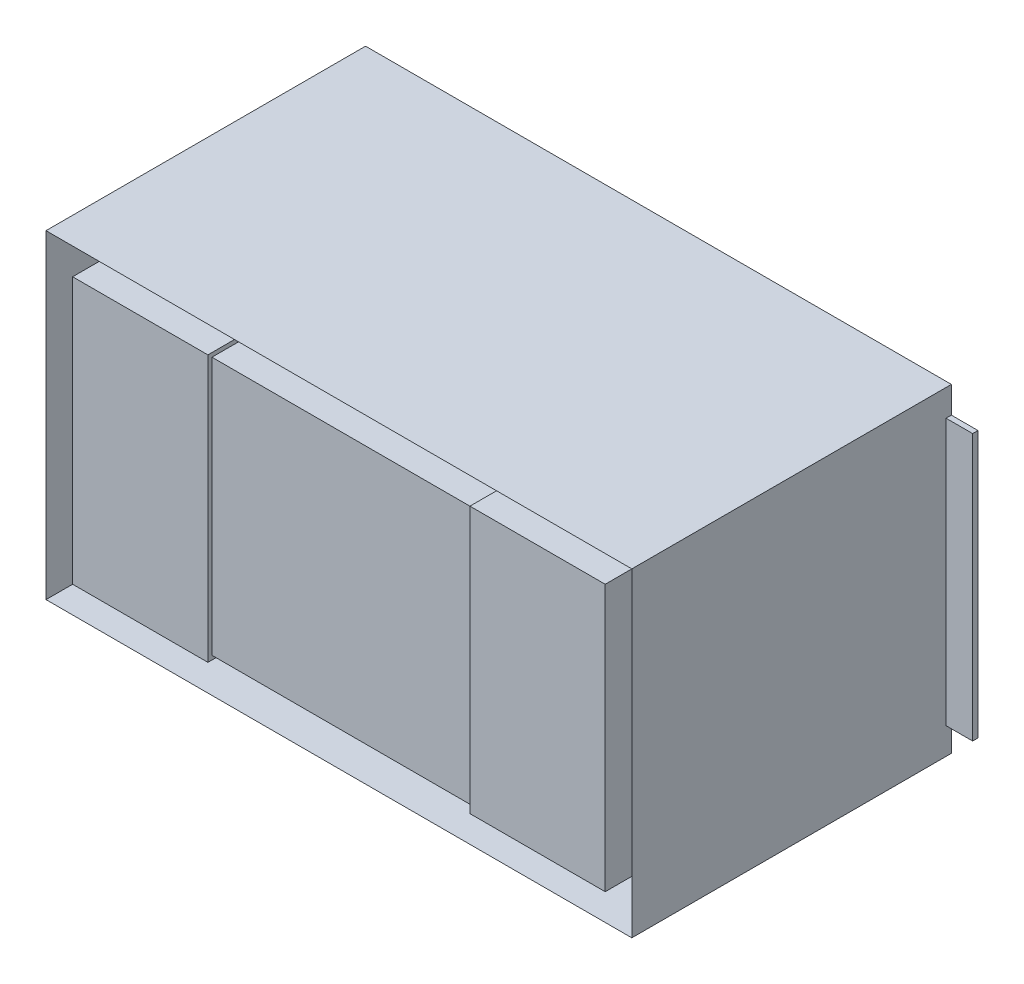
ISO-10303-21;
HEADER;
FILE_DESCRIPTION(('STEP AP214'),'2;1');
FILE_NAME('part.step','',(''),(''),'','','');
FILE_SCHEMA(('AUTOMOTIVE_DESIGN { 1 0 10303 214 1 1 1 1 }'));
ENDSEC;
DATA;
#1=APPLICATION_CONTEXT('core data for automotive mechanical design processes');
#2=APPLICATION_PROTOCOL_DEFINITION('international standard','automotive_design',2000,#1);
#3=PRODUCT_CONTEXT('',#1,'mechanical');
#4=PRODUCT('Part','Part','',(#3));
#5=PRODUCT_RELATED_PRODUCT_CATEGORY('part','',(#4));
#6=PRODUCT_DEFINITION_FORMATION('','',#4);
#7=PRODUCT_DEFINITION_CONTEXT('part definition',#1,'design');
#8=PRODUCT_DEFINITION('design','',#6,#7);
#9=PRODUCT_DEFINITION_SHAPE('','',#8);
#10=(LENGTH_UNIT() NAMED_UNIT(*) SI_UNIT(.MILLI.,.METRE.));
#11=(NAMED_UNIT(*) PLANE_ANGLE_UNIT() SI_UNIT($,.RADIAN.));
#12=(NAMED_UNIT(*) SI_UNIT($,.STERADIAN.) SOLID_ANGLE_UNIT());
#13=UNCERTAINTY_MEASURE_WITH_UNIT(LENGTH_MEASURE(1.E-05),#10,'distance_accuracy_value','');
#14=(GEOMETRIC_REPRESENTATION_CONTEXT(3) GLOBAL_UNCERTAINTY_ASSIGNED_CONTEXT((#13)) GLOBAL_UNIT_ASSIGNED_CONTEXT((#10,
#11,#12)) REPRESENTATION_CONTEXT('',''));
#15=CARTESIAN_POINT('',(0.,0.,0.));
#16=DIRECTION('',(0.,0.,1.));
#17=DIRECTION('',(1.,0.,0.));
#18=AXIS2_PLACEMENT_3D('',#15,#16,#17);
#19=CARTESIAN_POINT('',(-0.5999988,0.2500122,0.0762));
#20=DIRECTION('',(-1.,0.,0.));
#21=DIRECTION('',(0.,0.,1.));
#22=AXIS2_PLACEMENT_3D('',#19,#20,#21);
#23=PLANE('',#22);
#24=DIRECTION('',(0.,0.,1.));
#25=VECTOR('',#24,1.);
#26=CARTESIAN_POINT('',(-0.5999988,-0.2500081333333,0.0762));
#27=LINE('',#26,#25);
#28=CARTESIAN_POINT('',(-0.5999988,-0.2500081333333,0.0762));
#29=VERTEX_POINT('',#28);
#30=CARTESIAN_POINT('',(-0.5999988,-0.2500081333333,0.0862));
#31=VERTEX_POINT('',#30);
#32=EDGE_CURVE('P0_E325',#29,#31,#27,.T.);
#33=ORIENTED_EDGE('',*,*,#32,.T.);
#34=DIRECTION('',(0.,-1.,0.));
#35=VECTOR('',#34,1.);
#36=CARTESIAN_POINT('',(-0.5999988,0.2500081333333,0.0862));
#37=LINE('',#36,#35);
#38=CARTESIAN_POINT('',(-0.5999988,0.2500081333333,0.0862));
#39=VERTEX_POINT('',#38);
#40=EDGE_CURVE('P0_E345',#39,#31,#37,.T.);
#41=ORIENTED_EDGE('',*,*,#40,.F.);
#42=DIRECTION('',(0.,0.,1.));
#43=VECTOR('',#42,1.);
#44=CARTESIAN_POINT('',(-0.5999988,0.2500081333333,0.0762));
#45=LINE('',#44,#43);
#46=CARTESIAN_POINT('',(-0.5999988,0.2500081333333,0.0762));
#47=VERTEX_POINT('',#46);
#48=EDGE_CURVE('P0_E310',#47,#39,#45,.T.);
#49=ORIENTED_EDGE('',*,*,#48,.F.);
#50=DIRECTION('',(0.,-1.,0.));
#51=VECTOR('',#50,1.);
#52=CARTESIAN_POINT('',(-0.5999988,0.2500081333333,0.0762));
#53=LINE('',#52,#51);
#54=EDGE_CURVE('P0_E399',#47,#29,#53,.T.);
#55=ORIENTED_EDGE('',*,*,#54,.T.);
#56=EDGE_LOOP('',(#33,#41,#49,#55));
#57=FACE_BOUND('',#56,.T.);
#58=ADVANCED_FACE('P0_F18',(#57),#23,.T.);
#59=CARTESIAN_POINT('',(0.5999988,-0.2500122,0.0762));
#60=DIRECTION('',(1.,0.,0.));
#61=DIRECTION('',(0.,1.,0.));
#62=AXIS2_PLACEMENT_3D('',#59,#60,#61);
#63=PLANE('',#62);
#64=DIRECTION('',(0.,0.,1.));
#65=VECTOR('',#64,1.);
#66=CARTESIAN_POINT('',(0.5999988,0.2500081333333,0.0762));
#67=LINE('',#66,#65);
#68=CARTESIAN_POINT('',(0.5999988,0.2500081333333,0.0762));
#69=VERTEX_POINT('',#68);
#70=CARTESIAN_POINT('',(0.5999988,0.2500081333333,0.0862));
#71=VERTEX_POINT('',#70);
#72=EDGE_CURVE('P0_E434',#69,#71,#67,.T.);
#73=ORIENTED_EDGE('',*,*,#72,.T.);
#74=DIRECTION('',(0.,1.,0.));
#75=VECTOR('',#74,1.);
#76=CARTESIAN_POINT('',(0.5999988,-0.2500081333333,0.0862));
#77=LINE('',#76,#75);
#78=CARTESIAN_POINT('',(0.5999988,-0.2500081333333,0.0862));
#79=VERTEX_POINT('',#78);
#80=EDGE_CURVE('P0_E272',#79,#71,#77,.T.);
#81=ORIENTED_EDGE('',*,*,#80,.F.);
#82=DIRECTION('',(0.,0.,1.));
#83=VECTOR('',#82,1.);
#84=CARTESIAN_POINT('',(0.5999988,-0.2500081333333,0.0762));
#85=LINE('',#84,#83);
#86=CARTESIAN_POINT('',(0.5999988,-0.2500081333333,0.0762));
#87=VERTEX_POINT('',#86);
#88=EDGE_CURVE('P0_E384',#87,#79,#85,.T.);
#89=ORIENTED_EDGE('',*,*,#88,.F.);
#90=DIRECTION('',(0.,1.,0.));
#91=VECTOR('',#90,1.);
#92=CARTESIAN_POINT('',(0.5999988,-0.2500081333333,0.0762));
#93=LINE('',#92,#91);
#94=EDGE_CURVE('P0_E404',#87,#69,#93,.T.);
#95=ORIENTED_EDGE('',*,*,#94,.T.);
#96=EDGE_LOOP('',(#73,#81,#89,#95));
#97=FACE_BOUND('',#96,.T.);
#98=ADVANCED_FACE('P0_F432',(#97),#63,.T.);
#99=CARTESIAN_POINT('',(-0.5,0.25,0.0762));
#100=DIRECTION('',(-1.,0.,0.));
#101=DIRECTION('',(0.,0.,1.));
#102=AXIS2_PLACEMENT_3D('',#99,#100,#101);
#103=PLANE('',#102);
#104=DIRECTION('',(0.,6.89265536701531E-06,0.999999999976246));
#105=VECTOR('',#104,1.);
#106=CARTESIAN_POINT('',(-0.5,-0.2500040666667,0.0862));
#107=LINE('',#106,#105);
#108=CARTESIAN_POINT('',(-0.5,-0.2500040666667,0.0862));
#109=VERTEX_POINT('',#108);
#110=CARTESIAN_POINT('',(-0.5,-0.25,0.6762));
#111=VERTEX_POINT('',#110);
#112=EDGE_CURVE('P0_E297',#109,#111,#107,.T.);
#113=ORIENTED_EDGE('',*,*,#112,.T.);
#114=DIRECTION('',(0.,-1.,0.));
#115=VECTOR('',#114,1.);
#116=CARTESIAN_POINT('',(-0.5,0.25,0.6762));
#117=LINE('',#116,#115);
#118=CARTESIAN_POINT('',(-0.5,0.25,0.6762));
#119=VERTEX_POINT('',#118);
#120=EDGE_CURVE('P0_E11',#119,#111,#117,.T.);
#121=ORIENTED_EDGE('',*,*,#120,.F.);
#122=DIRECTION('',(0.,-6.89265536701531E-06,0.999999999976246));
#123=VECTOR('',#122,1.);
#124=CARTESIAN_POINT('',(-0.5,0.2500040666667,0.0862));
#125=LINE('',#124,#123);
#126=CARTESIAN_POINT('',(-0.5,0.2500040666667,0.0862));
#127=VERTEX_POINT('',#126);
#128=EDGE_CURVE('P0_E22',#127,#119,#125,.T.);
#129=ORIENTED_EDGE('',*,*,#128,.F.);
#130=DIRECTION('',(0.,-1.,0.));
#131=VECTOR('',#130,1.);
#132=CARTESIAN_POINT('',(-0.5,0.2500040666667,0.0862));
#133=LINE('',#132,#131);
#134=EDGE_CURVE('P0_E281',#127,#109,#133,.T.);
#135=ORIENTED_EDGE('',*,*,#134,.T.);
#136=EDGE_LOOP('',(#113,#121,#129,#135));
#137=FACE_BOUND('',#136,.T.);
#138=ADVANCED_FACE('P0_F484',(#137),#103,.T.);
#139=CARTESIAN_POINT('',(0.,0.,0.6762));
#140=DIRECTION('',(0.,0.,1.));
#141=DIRECTION('',(1.,0.,0.));
#142=AXIS2_PLACEMENT_3D('',#139,#140,#141);
#143=PLANE('',#142);
#144=DIRECTION('',(1.,0.,0.));
#145=VECTOR('',#144,1.);
#146=CARTESIAN_POINT('',(0.246,-0.25,0.6762));
#147=LINE('',#146,#145);
#148=CARTESIAN_POINT('',(0.246,-0.25,0.6762));
#149=VERTEX_POINT('',#148);
#150=CARTESIAN_POINT('',(0.5,-0.25,0.6762));
#151=VERTEX_POINT('',#150);
#152=EDGE_CURVE('P0_E381',#149,#151,#147,.T.);
#153=ORIENTED_EDGE('',*,*,#152,.T.);
#154=DIRECTION('',(0.,1.,0.));
#155=VECTOR('',#154,1.);
#156=CARTESIAN_POINT('',(0.5,-0.25,0.6762));
#157=LINE('',#156,#155);
#158=CARTESIAN_POINT('',(0.5,0.25,0.6762));
#159=VERTEX_POINT('',#158);
#160=EDGE_CURVE('P0_E282',#151,#159,#157,.T.);
#161=ORIENTED_EDGE('',*,*,#160,.T.);
#162=DIRECTION('',(-1.,0.,0.));
#163=VECTOR('',#162,1.);
#164=CARTESIAN_POINT('',(0.5,0.25,0.6762));
#165=LINE('',#164,#163);
#166=CARTESIAN_POINT('',(0.246,0.25,0.6762));
#167=VERTEX_POINT('',#166);
#168=EDGE_CURVE('P0_E287',#159,#167,#165,.T.);
#169=ORIENTED_EDGE('',*,*,#168,.T.);
#170=DIRECTION('',(0.,1.,0.));
#171=VECTOR('',#170,1.);
#172=CARTESIAN_POINT('',(0.246,-0.25,0.6762));
#173=LINE('',#172,#171);
#174=EDGE_CURVE('P0_E333',#149,#167,#173,.T.);
#175=ORIENTED_EDGE('',*,*,#174,.F.);
#176=EDGE_LOOP('',(#153,#161,#169,#175));
#177=FACE_BOUND('',#176,.T.);
#178=ADVANCED_FACE('P0_F1182',(#177),#143,.T.);
#179=CARTESIAN_POINT('',(0.,0.,0.6762));
#180=DIRECTION('',(0.,0.,1.));
#181=DIRECTION('',(1.,0.,0.));
#182=AXIS2_PLACEMENT_3D('',#179,#180,#181);
#183=PLANE('',#182);
#184=DIRECTION('',(-1.,0.,0.));
#185=VECTOR('',#184,1.);
#186=CARTESIAN_POINT('',(-0.246,0.25,0.6762));
#187=LINE('',#186,#185);
#188=CARTESIAN_POINT('',(-0.246,0.25,0.6762));
#189=VERTEX_POINT('',#188);
#190=EDGE_CURVE('P0_E473',#189,#119,#187,.T.);
#191=ORIENTED_EDGE('',*,*,#190,.T.);
#192=ORIENTED_EDGE('',*,*,#120,.T.);
#193=DIRECTION('',(1.,0.,0.));
#194=VECTOR('',#193,1.);
#195=CARTESIAN_POINT('',(-0.5,-0.25,0.6762));
#196=LINE('',#195,#194);
#197=CARTESIAN_POINT('',(-0.246,-0.25,0.6762));
#198=VERTEX_POINT('',#197);
#199=EDGE_CURVE('P0_E293',#111,#198,#196,.T.);
#200=ORIENTED_EDGE('',*,*,#199,.T.);
#201=DIRECTION('',(0.,1.,0.));
#202=VECTOR('',#201,1.);
#203=CARTESIAN_POINT('',(-0.246,-0.25,0.6762));
#204=LINE('',#203,#202);
#205=EDGE_CURVE('P0_E29',#198,#189,#204,.T.);
#206=ORIENTED_EDGE('',*,*,#205,.T.);
#207=EDGE_LOOP('',(#191,#192,#200,#206));
#208=FACE_BOUND('',#207,.T.);
#209=ADVANCED_FACE('P0_F492',(#208),#183,.T.);
#210=CARTESIAN_POINT('',(-0.246,-0.25,0.0762));
#211=DIRECTION('',(-1.,0.,0.));
#212=DIRECTION('',(0.,0.,1.));
#213=AXIS2_PLACEMENT_3D('',#210,#211,#212);
#214=PLANE('',#213);
#215=DIRECTION('',(0.,0.,-1.));
#216=VECTOR('',#215,1.);
#217=CARTESIAN_POINT('',(-0.246,-0.24238,0.66858));
#218=LINE('',#217,#216);
#219=CARTESIAN_POINT('',(-0.246,-0.24238,0.66858));
#220=VERTEX_POINT('',#219);
#221=CARTESIAN_POINT('',(-0.246,-0.24238,0.0862));
#222=VERTEX_POINT('',#221);
#223=EDGE_CURVE('P0_E43',#220,#222,#218,.T.);
#224=ORIENTED_EDGE('',*,*,#223,.F.);
#225=DIRECTION('',(0.,-1.,0.));
#226=VECTOR('',#225,1.);
#227=CARTESIAN_POINT('',(-0.246,0.24238,0.66858));
#228=LINE('',#227,#226);
#229=CARTESIAN_POINT('',(-0.246,0.24238,0.66858));
#230=VERTEX_POINT('',#229);
#231=EDGE_CURVE('P0_E342',#230,#220,#228,.T.);
#232=ORIENTED_EDGE('',*,*,#231,.F.);
#233=DIRECTION('',(0.,0.,1.));
#234=VECTOR('',#233,1.);
#235=CARTESIAN_POINT('',(-0.246,0.24238,0.0862));
#236=LINE('',#235,#234);
#237=CARTESIAN_POINT('',(-0.246,0.24238,0.0862));
#238=VERTEX_POINT('',#237);
#239=EDGE_CURVE('P0_E239',#238,#230,#236,.T.);
#240=ORIENTED_EDGE('',*,*,#239,.F.);
#241=DIRECTION('',(0.,1.,0.));
#242=VECTOR('',#241,1.);
#243=CARTESIAN_POINT('',(-0.246,0.24238,0.0862));
#244=LINE('',#243,#242);
#245=CARTESIAN_POINT('',(-0.246,0.2500040666667,0.0862));
#246=VERTEX_POINT('',#245);
#247=EDGE_CURVE('P0_E303',#238,#246,#244,.T.);
#248=ORIENTED_EDGE('',*,*,#247,.T.);
#249=DIRECTION('',(0.,-6.89265536701531E-06,0.999999999976246));
#250=VECTOR('',#249,1.);
#251=CARTESIAN_POINT('',(-0.246,0.2500040666667,0.0862));
#252=LINE('',#251,#250);
#253=EDGE_CURVE('P0_E469',#246,#189,#252,.T.);
#254=ORIENTED_EDGE('',*,*,#253,.T.);
#255=ORIENTED_EDGE('',*,*,#205,.F.);
#256=DIRECTION('',(0.,6.89265536701531E-06,0.999999999976246));
#257=VECTOR('',#256,1.);
#258=CARTESIAN_POINT('',(-0.246,-0.2500040666667,0.0862));
#259=LINE('',#258,#257);
#260=CARTESIAN_POINT('',(-0.246,-0.2500040666667,0.0862));
#261=VERTEX_POINT('',#260);
#262=EDGE_CURVE('P0_E355',#261,#198,#259,.T.);
#263=ORIENTED_EDGE('',*,*,#262,.F.);
#264=DIRECTION('',(0.,1.,0.));
#265=VECTOR('',#264,1.);
#266=CARTESIAN_POINT('',(-0.246,-0.2500040666667,0.0862));
#267=LINE('',#266,#265);
#268=EDGE_CURVE('P0_E364',#261,#222,#267,.T.);
#269=ORIENTED_EDGE('',*,*,#268,.T.);
#270=EDGE_LOOP('',(#224,#232,#240,#248,#254,#255,#263,#269));
#271=FACE_BOUND('',#270,.T.);
#272=ADVANCED_FACE('P0_F1121',(#271),#214,.F.);
#273=CARTESIAN_POINT('',(-0.246,-0.24238,0.6762));
#274=DIRECTION('',(0.,1.,0.));
#275=DIRECTION('',(1.,0.,0.));
#276=AXIS2_PLACEMENT_3D('',#273,#274,#275);
#277=PLANE('',#276);
#278=DIRECTION('',(0.,0.,1.));
#279=VECTOR('',#278,1.);
#280=CARTESIAN_POINT('',(-0.1999996,-0.24238,0.08382));
#281=LINE('',#280,#279);
#282=CARTESIAN_POINT('',(-0.1999996,-0.24238,0.08382));
#283=VERTEX_POINT('',#282);
#284=CARTESIAN_POINT('',(-0.1999996,-0.24238,0.0862));
#285=VERTEX_POINT('',#284);
#286=EDGE_CURVE('P0_E240',#283,#285,#281,.T.);
#287=ORIENTED_EDGE('',*,*,#286,.F.);
#288=DIRECTION('',(1.,0.,0.));
#289=VECTOR('',#288,1.);
#290=CARTESIAN_POINT('',(-0.1999996,-0.24238,0.08382));
#291=LINE('',#290,#289);
#292=CARTESIAN_POINT('',(0.1999996,-0.24238,0.08382));
#293=VERTEX_POINT('',#292);
#294=EDGE_CURVE('P0_E247',#283,#293,#291,.T.);
#295=ORIENTED_EDGE('',*,*,#294,.T.);
#296=DIRECTION('',(0.,0.,1.));
#297=VECTOR('',#296,1.);
#298=CARTESIAN_POINT('',(0.1999996,-0.24238,0.08382));
#299=LINE('',#298,#297);
#300=CARTESIAN_POINT('',(0.1999996,-0.24238,0.0862));
#301=VERTEX_POINT('',#300);
#302=EDGE_CURVE('P0_E266',#293,#301,#299,.T.);
#303=ORIENTED_EDGE('',*,*,#302,.T.);
#304=DIRECTION('',(1.,0.,0.));
#305=VECTOR('',#304,1.);
#306=CARTESIAN_POINT('',(0.1999996,-0.24238,0.0862));
#307=LINE('',#306,#305);
#308=CARTESIAN_POINT('',(0.246,-0.24238,0.0862));
#309=VERTEX_POINT('',#308);
#310=EDGE_CURVE('P0_E299',#301,#309,#307,.T.);
#311=ORIENTED_EDGE('',*,*,#310,.T.);
#312=DIRECTION('',(0.,0.,-1.));
#313=VECTOR('',#312,1.);
#314=CARTESIAN_POINT('',(0.246,-0.24238,0.66858));
#315=LINE('',#314,#313);
#316=CARTESIAN_POINT('',(0.246,-0.24238,0.66858));
#317=VERTEX_POINT('',#316);
#318=EDGE_CURVE('P0_E348',#317,#309,#315,.T.);
#319=ORIENTED_EDGE('',*,*,#318,.F.);
#320=DIRECTION('',(1.,0.,0.));
#321=VECTOR('',#320,1.);
#322=CARTESIAN_POINT('',(-0.246,-0.24238,0.66858));
#323=LINE('',#322,#321);
#324=EDGE_CURVE('P0_E339',#220,#317,#323,.T.);
#325=ORIENTED_EDGE('',*,*,#324,.F.);
#326=ORIENTED_EDGE('',*,*,#223,.T.);
#327=DIRECTION('',(1.,0.,0.));
#328=VECTOR('',#327,1.);
#329=CARTESIAN_POINT('',(-0.246,-0.24238,0.0862));
#330=LINE('',#329,#328);
#331=EDGE_CURVE('P0_E367',#222,#285,#330,.T.);
#332=ORIENTED_EDGE('',*,*,#331,.T.);
#333=EDGE_LOOP('',(#287,#295,#303,#311,#319,#325,#326,#332));
#334=FACE_BOUND('',#333,.T.);
#335=ADVANCED_FACE('P0_F1057',(#334),#277,.F.);
#336=CARTESIAN_POINT('',(-0.246,0.25,0.66858));
#337=DIRECTION('',(0.,0.,-1.));
#338=DIRECTION('',(0.,-1.,0.));
#339=AXIS2_PLACEMENT_3D('',#336,#337,#338);
#340=PLANE('',#339);
#341=ORIENTED_EDGE('',*,*,#231,.T.);
#342=ORIENTED_EDGE('',*,*,#324,.T.);
#343=DIRECTION('',(0.,-1.,0.));
#344=VECTOR('',#343,1.);
#345=CARTESIAN_POINT('',(0.246,0.24238,0.66858));
#346=LINE('',#345,#344);
#347=CARTESIAN_POINT('',(0.246,0.24238,0.66858));
#348=VERTEX_POINT('',#347);
#349=EDGE_CURVE('P0_E316',#348,#317,#346,.T.);
#350=ORIENTED_EDGE('',*,*,#349,.F.);
#351=DIRECTION('',(1.,0.,0.));
#352=VECTOR('',#351,1.);
#353=CARTESIAN_POINT('',(-0.246,0.24238,0.66858));
#354=LINE('',#353,#352);
#355=EDGE_CURVE('P0_E390',#230,#348,#354,.T.);
#356=ORIENTED_EDGE('',*,*,#355,.F.);
#357=EDGE_LOOP('',(#341,#342,#350,#356));
#358=FACE_BOUND('',#357,.T.);
#359=ADVANCED_FACE('P0_F1052',(#358),#340,.F.);
#360=CARTESIAN_POINT('',(-0.246,0.24238,0.0762));
#361=DIRECTION('',(0.,-1.,0.));
#362=DIRECTION('',(0.,0.,-1.));
#363=AXIS2_PLACEMENT_3D('',#360,#361,#362);
#364=PLANE('',#363);
#365=ORIENTED_EDGE('',*,*,#239,.T.);
#366=ORIENTED_EDGE('',*,*,#355,.T.);
#367=DIRECTION('',(0.,0.,1.));
#368=VECTOR('',#367,1.);
#369=CARTESIAN_POINT('',(0.246,0.24238,0.0862));
#370=LINE('',#369,#368);
#371=CARTESIAN_POINT('',(0.246,0.24238,0.0862));
#372=VERTEX_POINT('',#371);
#373=EDGE_CURVE('P0_E312',#372,#348,#370,.T.);
#374=ORIENTED_EDGE('',*,*,#373,.F.);
#375=DIRECTION('',(1.,0.,0.));
#376=VECTOR('',#375,1.);
#377=CARTESIAN_POINT('',(0.1999996,0.24238,0.0862));
#378=LINE('',#377,#376);
#379=CARTESIAN_POINT('',(0.1999996,0.24238,0.0862));
#380=VERTEX_POINT('',#379);
#381=EDGE_CURVE('P0_E286',#380,#372,#378,.T.);
#382=ORIENTED_EDGE('',*,*,#381,.F.);
#383=DIRECTION('',(0.,0.,1.));
#384=VECTOR('',#383,1.);
#385=CARTESIAN_POINT('',(0.1999996,0.24238,0.08382));
#386=LINE('',#385,#384);
#387=CARTESIAN_POINT('',(0.1999996,0.24238,0.08382));
#388=VERTEX_POINT('',#387);
#389=EDGE_CURVE('P0_E254',#388,#380,#386,.T.);
#390=ORIENTED_EDGE('',*,*,#389,.F.);
#391=DIRECTION('',(1.,0.,0.));
#392=VECTOR('',#391,1.);
#393=CARTESIAN_POINT('',(-0.1999996,0.24238,0.08382));
#394=LINE('',#393,#392);
#395=CARTESIAN_POINT('',(-0.1999996,0.24238,0.08382));
#396=VERTEX_POINT('',#395);
#397=EDGE_CURVE('P0_E245',#396,#388,#394,.T.);
#398=ORIENTED_EDGE('',*,*,#397,.F.);
#399=DIRECTION('',(0.,0.,1.));
#400=VECTOR('',#399,1.);
#401=CARTESIAN_POINT('',(-0.1999996,0.24238,0.08382));
#402=LINE('',#401,#400);
#403=CARTESIAN_POINT('',(-0.1999996,0.24238,0.0862));
#404=VERTEX_POINT('',#403);
#405=EDGE_CURVE('P0_E228',#396,#404,#402,.T.);
#406=ORIENTED_EDGE('',*,*,#405,.T.);
#407=DIRECTION('',(1.,0.,0.));
#408=VECTOR('',#407,1.);
#409=CARTESIAN_POINT('',(-0.246,0.24238,0.0862));
#410=LINE('',#409,#408);
#411=EDGE_CURVE('P0_E270',#238,#404,#410,.T.);
#412=ORIENTED_EDGE('',*,*,#411,.F.);
#413=EDGE_LOOP('',(#365,#366,#374,#382,#390,#398,#406,#412));
#414=FACE_BOUND('',#413,.T.);
#415=ADVANCED_FACE('P0_F252',(#414),#364,.F.);
#416=CARTESIAN_POINT('',(-0.1999996,-0.2500122,0.0762));
#417=DIRECTION('',(1.,0.,0.));
#418=DIRECTION('',(0.,1.,0.));
#419=AXIS2_PLACEMENT_3D('',#416,#417,#418);
#420=PLANE('',#419);
#421=ORIENTED_EDGE('',*,*,#286,.T.);
#422=DIRECTION('',(0.,1.,0.));
#423=VECTOR('',#422,1.);
#424=CARTESIAN_POINT('',(-0.1999996,-0.2500081333333,0.0862));
#425=LINE('',#424,#423);
#426=CARTESIAN_POINT('',(-0.1999996,-0.2500081333333,0.0862));
#427=VERTEX_POINT('',#426);
#428=EDGE_CURVE('P0_E280',#427,#285,#425,.T.);
#429=ORIENTED_EDGE('',*,*,#428,.F.);
#430=DIRECTION('',(0.,0.,1.));
#431=VECTOR('',#430,1.);
#432=CARTESIAN_POINT('',(-0.1999996,-0.2500081333333,0.0762));
#433=LINE('',#432,#431);
#434=CARTESIAN_POINT('',(-0.1999996,-0.2500081333333,0.0762));
#435=VERTEX_POINT('',#434);
#436=EDGE_CURVE('P0_E328',#435,#427,#433,.T.);
#437=ORIENTED_EDGE('',*,*,#436,.F.);
#438=DIRECTION('',(0.,1.,0.));
#439=VECTOR('',#438,1.);
#440=CARTESIAN_POINT('',(-0.1999996,-0.2500081333333,0.0762));
#441=LINE('',#440,#439);
#442=CARTESIAN_POINT('',(-0.1999996,0.2500081333333,0.0762));
#443=VERTEX_POINT('',#442);
#444=EDGE_CURVE('P0_E338',#435,#443,#441,.T.);
#445=ORIENTED_EDGE('',*,*,#444,.T.);
#446=DIRECTION('',(0.,0.,1.));
#447=VECTOR('',#446,1.);
#448=CARTESIAN_POINT('',(-0.1999996,0.2500081333333,0.0762));
#449=LINE('',#448,#447);
#450=CARTESIAN_POINT('',(-0.1999996,0.2500081333333,0.0862));
#451=VERTEX_POINT('',#450);
#452=EDGE_CURVE('P0_E334',#443,#451,#449,.T.);
#453=ORIENTED_EDGE('',*,*,#452,.T.);
#454=DIRECTION('',(0.,1.,0.));
#455=VECTOR('',#454,1.);
#456=CARTESIAN_POINT('',(-0.1999996,0.24238,0.0862));
#457=LINE('',#456,#455);
#458=EDGE_CURVE('P0_E233',#404,#451,#457,.T.);
#459=ORIENTED_EDGE('',*,*,#458,.F.);
#460=ORIENTED_EDGE('',*,*,#405,.F.);
#461=DIRECTION('',(0.,1.,0.));
#462=VECTOR('',#461,1.);
#463=CARTESIAN_POINT('',(-0.1999996,-0.24238,0.08382));
#464=LINE('',#463,#462);
#465=EDGE_CURVE('P0_E230',#283,#396,#464,.T.);
#466=ORIENTED_EDGE('',*,*,#465,.F.);
#467=EDGE_LOOP('',(#421,#429,#437,#445,#453,#459,#460,#466));
#468=FACE_BOUND('',#467,.T.);
#469=ADVANCED_FACE('P0_F20',(#468),#420,.T.);
#470=CARTESIAN_POINT('',(-0.246,-0.25,0.08382));
#471=DIRECTION('',(0.,0.,1.));
#472=DIRECTION('',(1.,0.,0.));
#473=AXIS2_PLACEMENT_3D('',#470,#471,#472);
#474=PLANE('',#473);
#475=ORIENTED_EDGE('',*,*,#397,.T.);
#476=DIRECTION('',(0.,1.,0.));
#477=VECTOR('',#476,1.);
#478=CARTESIAN_POINT('',(0.1999996,-0.24238,0.08382));
#479=LINE('',#478,#477);
#480=EDGE_CURVE('P0_E256',#293,#388,#479,.T.);
#481=ORIENTED_EDGE('',*,*,#480,.F.);
#482=ORIENTED_EDGE('',*,*,#294,.F.);
#483=ORIENTED_EDGE('',*,*,#465,.T.);
#484=EDGE_LOOP('',(#475,#481,#482,#483));
#485=FACE_BOUND('',#484,.T.);
#486=ADVANCED_FACE('P0_F243',(#485),#474,.F.);
#487=CARTESIAN_POINT('',(0.1999996,0.2500122,0.0762));
#488=DIRECTION('',(-1.,0.,0.));
#489=DIRECTION('',(0.,0.,1.));
#490=AXIS2_PLACEMENT_3D('',#487,#488,#489);
#491=PLANE('',#490);
#492=ORIENTED_EDGE('',*,*,#389,.T.);
#493=DIRECTION('',(0.,-1.,0.));
#494=VECTOR('',#493,1.);
#495=CARTESIAN_POINT('',(0.1999996,0.2500081333333,0.0862));
#496=LINE('',#495,#494);
#497=CARTESIAN_POINT('',(0.1999996,0.2500081333333,0.0862));
#498=VERTEX_POINT('',#497);
#499=EDGE_CURVE('P0_E320',#498,#380,#496,.T.);
#500=ORIENTED_EDGE('',*,*,#499,.F.);
#501=DIRECTION('',(0.,0.,1.));
#502=VECTOR('',#501,1.);
#503=CARTESIAN_POINT('',(0.1999996,0.2500081333333,0.0762));
#504=LINE('',#503,#502);
#505=CARTESIAN_POINT('',(0.1999996,0.2500081333333,0.0762));
#506=VERTEX_POINT('',#505);
#507=EDGE_CURVE('P0_E416',#506,#498,#504,.T.);
#508=ORIENTED_EDGE('',*,*,#507,.F.);
#509=DIRECTION('',(0.,-1.,0.));
#510=VECTOR('',#509,1.);
#511=CARTESIAN_POINT('',(0.1999996,0.2500081333333,0.0762));
#512=LINE('',#511,#510);
#513=CARTESIAN_POINT('',(0.1999996,-0.2500081333333,0.0762));
#514=VERTEX_POINT('',#513);
#515=EDGE_CURVE('P0_E393',#506,#514,#512,.T.);
#516=ORIENTED_EDGE('',*,*,#515,.T.);
#517=DIRECTION('',(0.,0.,1.));
#518=VECTOR('',#517,1.);
#519=CARTESIAN_POINT('',(0.1999996,-0.2500081333333,0.0762));
#520=LINE('',#519,#518);
#521=CARTESIAN_POINT('',(0.1999996,-0.2500081333333,0.0862));
#522=VERTEX_POINT('',#521);
#523=EDGE_CURVE('P0_E298',#514,#522,#520,.T.);
#524=ORIENTED_EDGE('',*,*,#523,.T.);
#525=DIRECTION('',(0.,-1.,0.));
#526=VECTOR('',#525,1.);
#527=CARTESIAN_POINT('',(0.1999996,-0.24238,0.0862));
#528=LINE('',#527,#526);
#529=EDGE_CURVE('P0_E302',#301,#522,#528,.T.);
#530=ORIENTED_EDGE('',*,*,#529,.F.);
#531=ORIENTED_EDGE('',*,*,#302,.F.);
#532=ORIENTED_EDGE('',*,*,#480,.T.);
#533=EDGE_LOOP('',(#492,#500,#508,#516,#524,#530,#531,#532));
#534=FACE_BOUND('',#533,.T.);
#535=ADVANCED_FACE('P0_F1095',(#534),#491,.T.);
#536=CARTESIAN_POINT('',(-0.5,-0.25,0.0762));
#537=DIRECTION('',(0.,-1.,0.));
#538=DIRECTION('',(0.,0.,-1.));
#539=AXIS2_PLACEMENT_3D('',#536,#537,#538);
#540=PLANE('',#539);
#541=ORIENTED_EDGE('',*,*,#199,.F.);
#542=ORIENTED_EDGE('',*,*,#112,.F.);
#543=DIRECTION('',(0.999999999173091,4.06671546391397E-05,0.));
#544=VECTOR('',#543,1.);
#545=CARTESIAN_POINT('',(-0.5999988,-0.2500081333333,0.0862));
#546=LINE('',#545,#544);
#547=EDGE_CURVE('P0_E453',#31,#109,#546,.T.);
#548=ORIENTED_EDGE('',*,*,#547,.F.);
#549=ORIENTED_EDGE('',*,*,#32,.F.);
#550=DIRECTION('',(-1.,0.,0.));
#551=VECTOR('',#550,1.);
#552=CARTESIAN_POINT('',(-0.1999996,-0.2500081333333,0.0762));
#553=LINE('',#552,#551);
#554=EDGE_CURVE('P0_E292',#435,#29,#553,.T.);
#555=ORIENTED_EDGE('',*,*,#554,.F.);
#556=ORIENTED_EDGE('',*,*,#436,.T.);
#557=DIRECTION('',(0.999999996092276,-8.84050280171378E-05,0.));
#558=VECTOR('',#557,1.);
#559=CARTESIAN_POINT('',(-0.246,-0.2500040666667,0.0862));
#560=LINE('',#559,#558);
#561=EDGE_CURVE('P0_E276',#261,#427,#560,.T.);
#562=ORIENTED_EDGE('',*,*,#561,.F.);
#563=ORIENTED_EDGE('',*,*,#262,.T.);
#564=EDGE_LOOP('',(#541,#542,#548,#549,#555,#556,#562,#563));
#565=FACE_BOUND('',#564,.T.);
#566=ADVANCED_FACE('P0_F489',(#565),#540,.T.);
#567=CARTESIAN_POINT('',(-0.5,-0.25,0.0762));
#568=DIRECTION('',(0.,-1.,0.));
#569=DIRECTION('',(0.,0.,-1.));
#570=AXIS2_PLACEMENT_3D('',#567,#568,#569);
#571=PLANE('',#570);
#572=ORIENTED_EDGE('',*,*,#88,.T.);
#573=DIRECTION('',(0.999999999173091,-4.06671546391397E-05,0.));
#574=VECTOR('',#573,1.);
#575=CARTESIAN_POINT('',(0.5,-0.2500040666667,0.0862));
#576=LINE('',#575,#574);
#577=CARTESIAN_POINT('',(0.5,-0.2500040666667,0.0862));
#578=VERTEX_POINT('',#577);
#579=EDGE_CURVE('P0_E275',#578,#79,#576,.T.);
#580=ORIENTED_EDGE('',*,*,#579,.F.);
#581=DIRECTION('',(0.,6.89265536701531E-06,0.999999999976246));
#582=VECTOR('',#581,1.);
#583=CARTESIAN_POINT('',(0.5,-0.2500040666667,0.0862));
#584=LINE('',#583,#582);
#585=EDGE_CURVE('P0_E285',#578,#151,#584,.T.);
#586=ORIENTED_EDGE('',*,*,#585,.T.);
#587=ORIENTED_EDGE('',*,*,#152,.F.);
#588=DIRECTION('',(0.,6.89265536701531E-06,0.999999999976246));
#589=VECTOR('',#588,1.);
#590=CARTESIAN_POINT('',(0.246,-0.2500040666667,0.0862));
#591=LINE('',#590,#589);
#592=CARTESIAN_POINT('',(0.246,-0.2500040666667,0.0862));
#593=VERTEX_POINT('',#592);
#594=EDGE_CURVE('P0_E329',#593,#149,#591,.T.);
#595=ORIENTED_EDGE('',*,*,#594,.F.);
#596=DIRECTION('',(0.999999996092276,8.84050280171378E-05,0.));
#597=VECTOR('',#596,1.);
#598=CARTESIAN_POINT('',(0.1999996,-0.2500081333333,0.0862));
#599=LINE('',#598,#597);
#600=EDGE_CURVE('P0_E324',#522,#593,#599,.T.);
#601=ORIENTED_EDGE('',*,*,#600,.F.);
#602=ORIENTED_EDGE('',*,*,#523,.F.);
#603=DIRECTION('',(-1.,0.,0.));
#604=VECTOR('',#603,1.);
#605=CARTESIAN_POINT('',(0.5999988,-0.2500081333333,0.0762));
#606=LINE('',#605,#604);
#607=EDGE_CURVE('P0_E398',#87,#514,#606,.T.);
#608=ORIENTED_EDGE('',*,*,#607,.F.);
#609=EDGE_LOOP('',(#572,#580,#586,#587,#595,#601,#602,#608));
#610=FACE_BOUND('',#609,.T.);
#611=ADVANCED_FACE('P0_F440',(#610),#571,.T.);
#612=CARTESIAN_POINT('',(0.5,-0.25,0.0762));
#613=DIRECTION('',(1.,0.,0.));
#614=DIRECTION('',(0.,1.,0.));
#615=AXIS2_PLACEMENT_3D('',#612,#613,#614);
#616=PLANE('',#615);
#617=DIRECTION('',(0.,-6.89265536701531E-06,0.999999999976246));
#618=VECTOR('',#617,1.);
#619=CARTESIAN_POINT('',(0.5,0.2500040666667,0.0862));
#620=LINE('',#619,#618);
#621=CARTESIAN_POINT('',(0.5,0.2500040666667,0.0862));
#622=VERTEX_POINT('',#621);
#623=EDGE_CURVE('P0_E291',#622,#159,#620,.T.);
#624=ORIENTED_EDGE('',*,*,#623,.T.);
#625=ORIENTED_EDGE('',*,*,#160,.F.);
#626=ORIENTED_EDGE('',*,*,#585,.F.);
#627=DIRECTION('',(0.,1.,0.));
#628=VECTOR('',#627,1.);
#629=CARTESIAN_POINT('',(0.5,-0.2500040666667,0.0862));
#630=LINE('',#629,#628);
#631=EDGE_CURVE('P0_E274',#578,#622,#630,.T.);
#632=ORIENTED_EDGE('',*,*,#631,.T.);
#633=EDGE_LOOP('',(#624,#625,#626,#632));
#634=FACE_BOUND('',#633,.T.);
#635=ADVANCED_FACE('P0_F1111',(#634),#616,.T.);
#636=CARTESIAN_POINT('',(0.,0.,0.0862));
#637=DIRECTION('',(0.,0.,1.));
#638=DIRECTION('',(1.,0.,0.));
#639=AXIS2_PLACEMENT_3D('',#636,#637,#638);
#640=PLANE('',#639);
#641=DIRECTION('',(-0.999999996092276,8.84050280171378E-05,0.));
#642=VECTOR('',#641,1.);
#643=CARTESIAN_POINT('',(0.246,0.2500040666667,0.0862));
#644=LINE('',#643,#642);
#645=CARTESIAN_POINT('',(0.246,0.2500040666667,0.0862));
#646=VERTEX_POINT('',#645);
#647=EDGE_CURVE('P0_E311',#646,#498,#644,.T.);
#648=ORIENTED_EDGE('',*,*,#647,.T.);
#649=ORIENTED_EDGE('',*,*,#499,.T.);
#650=ORIENTED_EDGE('',*,*,#381,.T.);
#651=DIRECTION('',(0.,1.,0.));
#652=VECTOR('',#651,1.);
#653=CARTESIAN_POINT('',(0.246,0.24238,0.0862));
#654=LINE('',#653,#652);
#655=EDGE_CURVE('P0_E317',#372,#646,#654,.T.);
#656=ORIENTED_EDGE('',*,*,#655,.T.);
#657=EDGE_LOOP('',(#648,#649,#650,#656));
#658=FACE_BOUND('',#657,.T.);
#659=ADVANCED_FACE('P0_F1044',(#658),#640,.T.);
#660=CARTESIAN_POINT('',(0.,0.,0.0862));
#661=DIRECTION('',(0.,0.,1.));
#662=DIRECTION('',(1.,0.,0.));
#663=AXIS2_PLACEMENT_3D('',#660,#661,#662);
#664=PLANE('',#663);
#665=ORIENTED_EDGE('',*,*,#310,.F.);
#666=ORIENTED_EDGE('',*,*,#529,.T.);
#667=ORIENTED_EDGE('',*,*,#600,.T.);
#668=DIRECTION('',(0.,1.,0.));
#669=VECTOR('',#668,1.);
#670=CARTESIAN_POINT('',(0.246,-0.2500040666667,0.0862));
#671=LINE('',#670,#669);
#672=EDGE_CURVE('P0_E352',#593,#309,#671,.T.);
#673=ORIENTED_EDGE('',*,*,#672,.T.);
#674=EDGE_LOOP('',(#665,#666,#667,#673));
#675=FACE_BOUND('',#674,.T.);
#676=ADVANCED_FACE('P0_F1038',(#675),#664,.T.);
#677=CARTESIAN_POINT('',(0.,0.,0.0862));
#678=DIRECTION('',(0.,0.,1.));
#679=DIRECTION('',(1.,0.,0.));
#680=AXIS2_PLACEMENT_3D('',#677,#678,#679);
#681=PLANE('',#680);
#682=ORIENTED_EDGE('',*,*,#411,.T.);
#683=ORIENTED_EDGE('',*,*,#458,.T.);
#684=DIRECTION('',(-0.999999996092276,-8.84050280171378E-05,0.));
#685=VECTOR('',#684,1.);
#686=CARTESIAN_POINT('',(-0.1999996,0.2500081333333,0.0862));
#687=LINE('',#686,#685);
#688=EDGE_CURVE('P0_E358',#451,#246,#687,.T.);
#689=ORIENTED_EDGE('',*,*,#688,.T.);
#690=ORIENTED_EDGE('',*,*,#247,.F.);
#691=EDGE_LOOP('',(#682,#683,#689,#690));
#692=FACE_BOUND('',#691,.T.);
#693=ADVANCED_FACE('P0_F1043',(#692),#681,.T.);
#694=CARTESIAN_POINT('',(0.,0.,0.0862));
#695=DIRECTION('',(0.,0.,1.));
#696=DIRECTION('',(1.,0.,0.));
#697=AXIS2_PLACEMENT_3D('',#694,#695,#696);
#698=PLANE('',#697);
#699=ORIENTED_EDGE('',*,*,#561,.T.);
#700=ORIENTED_EDGE('',*,*,#428,.T.);
#701=ORIENTED_EDGE('',*,*,#331,.F.);
#702=ORIENTED_EDGE('',*,*,#268,.F.);
#703=EDGE_LOOP('',(#699,#700,#701,#702));
#704=FACE_BOUND('',#703,.T.);
#705=ADVANCED_FACE('P0_F1076',(#704),#698,.T.);
#706=CARTESIAN_POINT('',(0.,0.,0.0862));
#707=DIRECTION('',(0.,0.,1.));
#708=DIRECTION('',(1.,0.,0.));
#709=AXIS2_PLACEMENT_3D('',#706,#707,#708);
#710=PLANE('',#709);
#711=DIRECTION('',(-0.999999999173091,4.06671546391397E-05,0.));
#712=VECTOR('',#711,1.);
#713=CARTESIAN_POINT('',(-0.5,0.2500040666667,0.0862));
#714=LINE('',#713,#712);
#715=EDGE_CURVE('P0_E377',#127,#39,#714,.T.);
#716=ORIENTED_EDGE('',*,*,#715,.T.);
#717=ORIENTED_EDGE('',*,*,#40,.T.);
#718=ORIENTED_EDGE('',*,*,#547,.T.);
#719=ORIENTED_EDGE('',*,*,#134,.F.);
#720=EDGE_LOOP('',(#716,#717,#718,#719));
#721=FACE_BOUND('',#720,.T.);
#722=ADVANCED_FACE('P0_F1085',(#721),#710,.T.);
#723=CARTESIAN_POINT('',(0.,0.,0.0862));
#724=DIRECTION('',(0.,0.,1.));
#725=DIRECTION('',(1.,0.,0.));
#726=AXIS2_PLACEMENT_3D('',#723,#724,#725);
#727=PLANE('',#726);
#728=ORIENTED_EDGE('',*,*,#579,.T.);
#729=ORIENTED_EDGE('',*,*,#80,.T.);
#730=DIRECTION('',(-0.999999999173091,-4.06671546391397E-05,0.));
#731=VECTOR('',#730,1.);
#732=CARTESIAN_POINT('',(0.5999988,0.2500081333333,0.0862));
#733=LINE('',#732,#731);
#734=EDGE_CURVE('P0_E371',#71,#622,#733,.T.);
#735=ORIENTED_EDGE('',*,*,#734,.T.);
#736=ORIENTED_EDGE('',*,*,#631,.F.);
#737=EDGE_LOOP('',(#728,#729,#735,#736));
#738=FACE_BOUND('',#737,.T.);
#739=ADVANCED_FACE('P0_F1127',(#738),#727,.T.);
#740=CARTESIAN_POINT('',(0.246,-0.25,0.08382));
#741=DIRECTION('',(1.,0.,0.));
#742=DIRECTION('',(0.,1.,0.));
#743=AXIS2_PLACEMENT_3D('',#740,#741,#742);
#744=PLANE('',#743);
#745=ORIENTED_EDGE('',*,*,#594,.T.);
#746=ORIENTED_EDGE('',*,*,#174,.T.);
#747=DIRECTION('',(0.,-6.89265536701531E-06,0.999999999976246));
#748=VECTOR('',#747,1.);
#749=CARTESIAN_POINT('',(0.246,0.2500040666667,0.0862));
#750=LINE('',#749,#748);
#751=EDGE_CURVE('P0_E306',#646,#167,#750,.T.);
#752=ORIENTED_EDGE('',*,*,#751,.F.);
#753=ORIENTED_EDGE('',*,*,#655,.F.);
#754=ORIENTED_EDGE('',*,*,#373,.T.);
#755=ORIENTED_EDGE('',*,*,#349,.T.);
#756=ORIENTED_EDGE('',*,*,#318,.T.);
#757=ORIENTED_EDGE('',*,*,#672,.F.);
#758=EDGE_LOOP('',(#745,#746,#752,#753,#754,#755,#756,#757));
#759=FACE_BOUND('',#758,.T.);
#760=ADVANCED_FACE('P0_F1132',(#759),#744,.F.);
#761=CARTESIAN_POINT('',(0.5,0.25,0.0762));
#762=DIRECTION('',(0.,1.,0.));
#763=DIRECTION('',(1.,0.,0.));
#764=AXIS2_PLACEMENT_3D('',#761,#762,#763);
#765=PLANE('',#764);
#766=ORIENTED_EDGE('',*,*,#48,.T.);
#767=ORIENTED_EDGE('',*,*,#715,.F.);
#768=ORIENTED_EDGE('',*,*,#128,.T.);
#769=ORIENTED_EDGE('',*,*,#190,.F.);
#770=ORIENTED_EDGE('',*,*,#253,.F.);
#771=ORIENTED_EDGE('',*,*,#688,.F.);
#772=ORIENTED_EDGE('',*,*,#452,.F.);
#773=DIRECTION('',(1.,0.,0.));
#774=VECTOR('',#773,1.);
#775=CARTESIAN_POINT('',(-0.5999988,0.2500081333333,0.0762));
#776=LINE('',#775,#774);
#777=EDGE_CURVE('P0_E403',#47,#443,#776,.T.);
#778=ORIENTED_EDGE('',*,*,#777,.F.);
#779=EDGE_LOOP('',(#766,#767,#768,#769,#770,#771,#772,#778));
#780=FACE_BOUND('',#779,.T.);
#781=ADVANCED_FACE('P0_F501',(#780),#765,.T.);
#782=CARTESIAN_POINT('',(0.5,0.25,0.0762));
#783=DIRECTION('',(0.,1.,0.));
#784=DIRECTION('',(1.,0.,0.));
#785=AXIS2_PLACEMENT_3D('',#782,#783,#784);
#786=PLANE('',#785);
#787=ORIENTED_EDGE('',*,*,#168,.F.);
#788=ORIENTED_EDGE('',*,*,#623,.F.);
#789=ORIENTED_EDGE('',*,*,#734,.F.);
#790=ORIENTED_EDGE('',*,*,#72,.F.);
#791=DIRECTION('',(1.,0.,0.));
#792=VECTOR('',#791,1.);
#793=CARTESIAN_POINT('',(0.1999996,0.2500081333333,0.0762));
#794=LINE('',#793,#792);
#795=EDGE_CURVE('P0_E397',#506,#69,#794,.T.);
#796=ORIENTED_EDGE('',*,*,#795,.F.);
#797=ORIENTED_EDGE('',*,*,#507,.T.);
#798=ORIENTED_EDGE('',*,*,#647,.F.);
#799=ORIENTED_EDGE('',*,*,#751,.T.);
#800=EDGE_LOOP('',(#787,#788,#789,#790,#796,#797,#798,#799));
#801=FACE_BOUND('',#800,.T.);
#802=ADVANCED_FACE('P0_F1067',(#801),#786,.T.);
#803=CARTESIAN_POINT('',(0.,0.,0.0762));
#804=DIRECTION('',(0.,0.,1.));
#805=DIRECTION('',(1.,0.,0.));
#806=AXIS2_PLACEMENT_3D('',#803,#804,#805);
#807=PLANE('',#806);
#808=ORIENTED_EDGE('',*,*,#54,.F.);
#809=ORIENTED_EDGE('',*,*,#777,.T.);
#810=ORIENTED_EDGE('',*,*,#444,.F.);
#811=ORIENTED_EDGE('',*,*,#554,.T.);
#812=EDGE_LOOP('',(#808,#809,#810,#811));
#813=FACE_BOUND('',#812,.T.);
#814=ADVANCED_FACE('P0_F1063',(#813),#807,.F.);
#815=CARTESIAN_POINT('',(0.,0.,0.0762));
#816=DIRECTION('',(0.,0.,1.));
#817=DIRECTION('',(1.,0.,0.));
#818=AXIS2_PLACEMENT_3D('',#815,#816,#817);
#819=PLANE('',#818);
#820=ORIENTED_EDGE('',*,*,#94,.F.);
#821=ORIENTED_EDGE('',*,*,#607,.T.);
#822=ORIENTED_EDGE('',*,*,#515,.F.);
#823=ORIENTED_EDGE('',*,*,#795,.T.);
#824=EDGE_LOOP('',(#820,#821,#822,#823));
#825=FACE_BOUND('',#824,.T.);
#826=ADVANCED_FACE('P0_F426',(#825),#819,.F.);
#827=CLOSED_SHELL('',(#58,#98,#138,#178,#209,#272,#335,#359,#415,#469,#486,#535,#566,#611,#635,
#659,#676,#693,#705,#722,#739,#760,#781,#802,#814,#826));
#828=MANIFOLD_SOLID_BREP('P0_B1',#827);
#829=CARTESIAN_POINT('',(0.55,0.3,0.0762));
#830=DIRECTION('',(0.,1.,0.));
#831=DIRECTION('',(1.,0.,0.));
#832=AXIS2_PLACEMENT_3D('',#829,#830,#831);
#833=PLANE('',#832);
#834=CARTESIAN_POINT('',(0.55,0.3,0.6762));
#835=DIRECTION('',(0.,0.,-1.));
#836=VECTOR('',#835,1.);
#837=LINE('',#834,#836);
#838=CARTESIAN_POINT('',(0.55,0.3,0.6762));
#839=VERTEX_POINT('',#838);
#840=CARTESIAN_POINT('',(0.55,0.3,0.0762));
#841=VERTEX_POINT('',#840);
#842=EDGE_CURVE('P1_E29',#839,#841,#837,.T.);
#843=ORIENTED_EDGE('',*,*,#842,.T.);
#844=CARTESIAN_POINT('',(0.55,0.3,0.0762));
#845=DIRECTION('',(-1.,0.,0.));
#846=VECTOR('',#845,1.);
#847=LINE('',#844,#846);
#848=CARTESIAN_POINT('',(-0.55,0.3,0.0762));
#849=VERTEX_POINT('',#848);
#850=EDGE_CURVE('P1_E11',#841,#849,#847,.T.);
#851=ORIENTED_EDGE('',*,*,#850,.T.);
#852=CARTESIAN_POINT('',(-0.55,0.3,0.0762));
#853=DIRECTION('',(0.,0.,1.));
#854=VECTOR('',#853,1.);
#855=LINE('',#852,#854);
#856=CARTESIAN_POINT('',(-0.55,0.3,0.6762));
#857=VERTEX_POINT('',#856);
#858=EDGE_CURVE('P1_E79',#849,#857,#855,.T.);
#859=ORIENTED_EDGE('',*,*,#858,.T.);
#860=CARTESIAN_POINT('',(-0.55,0.3,0.6762));
#861=DIRECTION('',(1.,0.,0.));
#862=VECTOR('',#861,1.);
#863=LINE('',#860,#862);
#864=EDGE_CURVE('P1_E122',#857,#839,#863,.T.);
#865=ORIENTED_EDGE('',*,*,#864,.T.);
#866=EDGE_LOOP('',(#843,#851,#859,#865));
#867=FACE_BOUND('',#866,.T.);
#868=ADVANCED_FACE('P1_F18',(#867),#833,.T.);
#869=CARTESIAN_POINT('',(0.55,-0.3,0.0762));
#870=DIRECTION('',(1.,0.,0.));
#871=DIRECTION('',(0.,1.,0.));
#872=AXIS2_PLACEMENT_3D('',#869,#870,#871);
#873=PLANE('',#872);
#874=CARTESIAN_POINT('',(0.55,-0.3,0.6762));
#875=DIRECTION('',(0.,0.,-1.));
#876=VECTOR('',#875,1.);
#877=LINE('',#874,#876);
#878=CARTESIAN_POINT('',(0.55,-0.3,0.6762));
#879=VERTEX_POINT('',#878);
#880=CARTESIAN_POINT('',(0.55,-0.3,0.0762));
#881=VERTEX_POINT('',#880);
#882=EDGE_CURVE('P1_E190',#879,#881,#877,.T.);
#883=ORIENTED_EDGE('',*,*,#882,.T.);
#884=CARTESIAN_POINT('',(0.55,-0.3,0.0762));
#885=DIRECTION('',(0.,1.,0.));
#886=VECTOR('',#885,1.);
#887=LINE('',#884,#886);
#888=EDGE_CURVE('P1_E37',#881,#841,#887,.T.);
#889=ORIENTED_EDGE('',*,*,#888,.T.);
#890=ORIENTED_EDGE('',*,*,#842,.F.);
#891=CARTESIAN_POINT('',(0.55,0.3,0.6762));
#892=DIRECTION('',(0.,-1.,0.));
#893=VECTOR('',#892,1.);
#894=LINE('',#891,#893);
#895=EDGE_CURVE('P1_E82',#839,#879,#894,.T.);
#896=ORIENTED_EDGE('',*,*,#895,.T.);
#897=EDGE_LOOP('',(#883,#889,#890,#896));
#898=FACE_BOUND('',#897,.T.);
#899=ADVANCED_FACE('P1_F99',(#898),#873,.T.);
#900=CARTESIAN_POINT('',(-0.55,0.3,0.0762));
#901=DIRECTION('',(-1.,0.,0.));
#902=DIRECTION('',(0.,0.,1.));
#903=AXIS2_PLACEMENT_3D('',#900,#901,#902);
#904=PLANE('',#903);
#905=ORIENTED_EDGE('',*,*,#858,.F.);
#906=CARTESIAN_POINT('',(-0.55,0.3,0.0762));
#907=DIRECTION('',(0.,-1.,0.));
#908=VECTOR('',#907,1.);
#909=LINE('',#906,#908);
#910=CARTESIAN_POINT('',(-0.55,-0.3,0.0762));
#911=VERTEX_POINT('',#910);
#912=EDGE_CURVE('P1_E75',#849,#911,#909,.T.);
#913=ORIENTED_EDGE('',*,*,#912,.T.);
#914=CARTESIAN_POINT('',(-0.55,-0.3,0.0762));
#915=DIRECTION('',(0.,0.,1.));
#916=VECTOR('',#915,1.);
#917=LINE('',#914,#916);
#918=CARTESIAN_POINT('',(-0.55,-0.3,0.6762));
#919=VERTEX_POINT('',#918);
#920=EDGE_CURVE('P1_E61',#911,#919,#917,.T.);
#921=ORIENTED_EDGE('',*,*,#920,.T.);
#922=CARTESIAN_POINT('',(-0.55,-0.3,0.6762));
#923=DIRECTION('',(0.,1.,0.));
#924=VECTOR('',#923,1.);
#925=LINE('',#922,#924);
#926=EDGE_CURVE('P1_E70',#919,#857,#925,.T.);
#927=ORIENTED_EDGE('',*,*,#926,.T.);
#928=EDGE_LOOP('',(#905,#913,#921,#927));
#929=FACE_BOUND('',#928,.T.);
#930=ADVANCED_FACE('P1_F77',(#929),#904,.T.);
#931=CARTESIAN_POINT('',(-0.55,-0.3,0.0762));
#932=DIRECTION('',(0.,-1.,0.));
#933=DIRECTION('',(0.,0.,-1.));
#934=AXIS2_PLACEMENT_3D('',#931,#932,#933);
#935=PLANE('',#934);
#936=ORIENTED_EDGE('',*,*,#920,.F.);
#937=CARTESIAN_POINT('',(-0.55,-0.3,0.0762));
#938=DIRECTION('',(1.,0.,0.));
#939=VECTOR('',#938,1.);
#940=LINE('',#937,#939);
#941=EDGE_CURVE('P1_E64',#911,#881,#940,.T.);
#942=ORIENTED_EDGE('',*,*,#941,.T.);
#943=ORIENTED_EDGE('',*,*,#882,.F.);
#944=CARTESIAN_POINT('',(0.55,-0.3,0.6762));
#945=DIRECTION('',(-1.,0.,0.));
#946=VECTOR('',#945,1.);
#947=LINE('',#944,#946);
#948=EDGE_CURVE('P1_E58',#879,#919,#947,.T.);
#949=ORIENTED_EDGE('',*,*,#948,.T.);
#950=EDGE_LOOP('',(#936,#942,#943,#949));
#951=FACE_BOUND('',#950,.T.);
#952=ADVANCED_FACE('P1_F19',(#951),#935,.T.);
#953=OPEN_SHELL('',(#868,#899,#930,#952));
#954=SHELL_BASED_SURFACE_MODEL('P1_B1',(#953));
#955=ADVANCED_BREP_SHAPE_REPRESENTATION('',(#18,#828),#14);
#956=MANIFOLD_SURFACE_SHAPE_REPRESENTATION('',(#18,#954),#14);
#957=SHAPE_REPRESENTATION('',(#18),#14);
#958=SHAPE_DEFINITION_REPRESENTATION(#9,#957);
#959=SHAPE_REPRESENTATION_RELATIONSHIP('','',#957,#955);
#960=SHAPE_REPRESENTATION_RELATIONSHIP('','',#957,#956);
ENDSEC;
END-ISO-10303-21;
